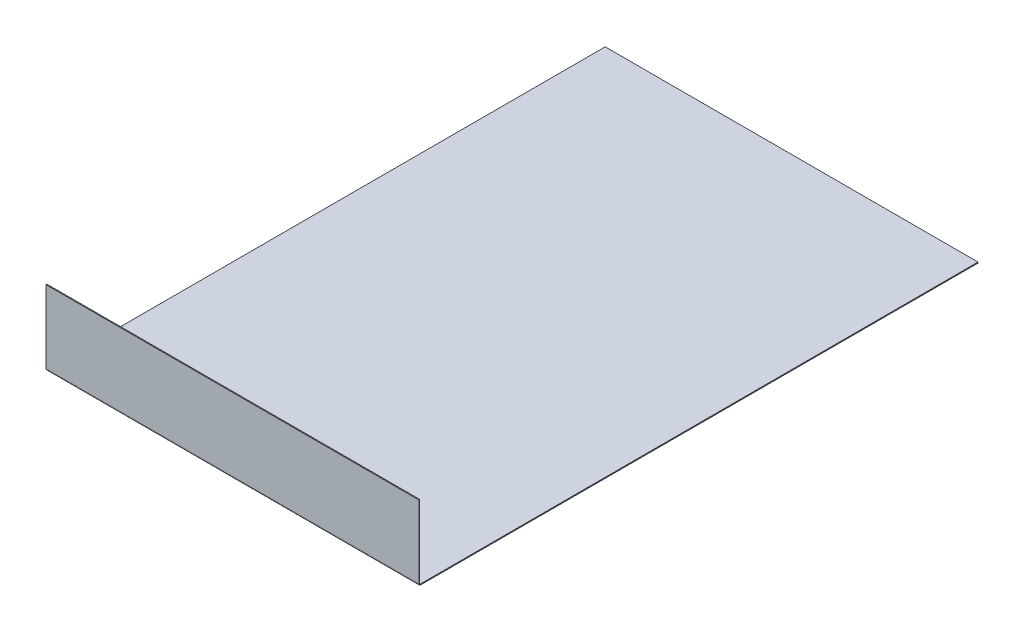
ISO-10303-21;
HEADER;
FILE_DESCRIPTION(('STEP AP214'),'2;1');
FILE_NAME('part.step','',(''),(''),'','','');
FILE_SCHEMA(('AUTOMOTIVE_DESIGN { 1 0 10303 214 1 1 1 1 }'));
ENDSEC;
DATA;
#1=APPLICATION_CONTEXT('core data for automotive mechanical design processes');
#2=APPLICATION_PROTOCOL_DEFINITION('international standard','automotive_design',2000,#1);
#3=PRODUCT_CONTEXT('',#1,'mechanical');
#4=PRODUCT('Part','Part','',(#3));
#5=PRODUCT_RELATED_PRODUCT_CATEGORY('part','',(#4));
#6=PRODUCT_DEFINITION_FORMATION('','',#4);
#7=PRODUCT_DEFINITION_CONTEXT('part definition',#1,'design');
#8=PRODUCT_DEFINITION('design','',#6,#7);
#9=PRODUCT_DEFINITION_SHAPE('','',#8);
#10=(LENGTH_UNIT() NAMED_UNIT(*) SI_UNIT(.MILLI.,.METRE.));
#11=(NAMED_UNIT(*) PLANE_ANGLE_UNIT() SI_UNIT($,.RADIAN.));
#12=(NAMED_UNIT(*) SI_UNIT($,.STERADIAN.) SOLID_ANGLE_UNIT());
#13=UNCERTAINTY_MEASURE_WITH_UNIT(LENGTH_MEASURE(1.E-05),#10,'distance_accuracy_value','');
#14=(GEOMETRIC_REPRESENTATION_CONTEXT(3) GLOBAL_UNCERTAINTY_ASSIGNED_CONTEXT((#13)) GLOBAL_UNIT_ASSIGNED_CONTEXT((#10,
#11,#12)) REPRESENTATION_CONTEXT('',''));
#15=CARTESIAN_POINT('',(0.,0.,0.));
#16=DIRECTION('',(0.,0.,1.));
#17=DIRECTION('',(1.,0.,0.));
#18=AXIS2_PLACEMENT_3D('',#15,#16,#17);
#19=CARTESIAN_POINT('',(-500.,2.5,750.));
#20=DIRECTION('',(0.,1.,0.));
#21=DIRECTION('',(1.,0.,0.));
#22=AXIS2_PLACEMENT_3D('',#19,#20,#21);
#23=PLANE('',#22);
#24=DIRECTION('',(1.,0.,0.));
#25=VECTOR('',#24,1.);
#26=CARTESIAN_POINT('',(-250.,2.5,1495.));
#27=LINE('',#26,#25);
#28=CARTESIAN_POINT('',(-1000.,2.5,1495.));
#29=VERTEX_POINT('',#28);
#30=CARTESIAN_POINT('',(0.,2.5,1495.));
#31=VERTEX_POINT('',#30);
#32=EDGE_CURVE('E162',#29,#31,#27,.T.);
#33=ORIENTED_EDGE('',*,*,#32,.T.);
#34=DIRECTION('',(0.,0.,1.));
#35=VECTOR('',#34,1.);
#36=CARTESIAN_POINT('',(0.,2.5,1500.));
#37=LINE('',#36,#35);
#38=CARTESIAN_POINT('',(0.,2.5,0.));
#39=VERTEX_POINT('',#38);
#40=EDGE_CURVE('E107',#39,#31,#37,.T.);
#41=ORIENTED_EDGE('',*,*,#40,.F.);
#42=DIRECTION('',(1.,0.,0.));
#43=VECTOR('',#42,1.);
#44=CARTESIAN_POINT('',(0.,2.5,0.));
#45=LINE('',#44,#43);
#46=CARTESIAN_POINT('',(-1000.,2.5,0.));
#47=VERTEX_POINT('',#46);
#48=EDGE_CURVE('E11',#47,#39,#45,.T.);
#49=ORIENTED_EDGE('',*,*,#48,.F.);
#50=DIRECTION('',(0.,0.,-1.));
#51=VECTOR('',#50,1.);
#52=CARTESIAN_POINT('',(-1000.,2.5,0.));
#53=LINE('',#52,#51);
#54=EDGE_CURVE('E164',#29,#47,#53,.T.);
#55=ORIENTED_EDGE('',*,*,#54,.F.);
#56=EDGE_LOOP('',(#33,#41,#49,#55));
#57=FACE_BOUND('',#56,.T.);
#58=ADVANCED_FACE('F17',(#57),#23,.T.);
#59=CARTESIAN_POINT('',(-1000.,0.,0.));
#60=DIRECTION('',(0.,0.,-1.));
#61=DIRECTION('',(0.,-1.,0.));
#62=AXIS2_PLACEMENT_3D('',#59,#60,#61);
#63=PLANE('',#62);
#64=ORIENTED_EDGE('',*,*,#48,.T.);
#65=DIRECTION('',(0.,1.,0.));
#66=VECTOR('',#65,1.);
#67=CARTESIAN_POINT('',(0.,0.,0.));
#68=LINE('',#67,#66);
#69=CARTESIAN_POINT('',(0.,0.,0.));
#70=VERTEX_POINT('',#69);
#71=EDGE_CURVE('E187',#70,#39,#68,.T.);
#72=ORIENTED_EDGE('',*,*,#71,.F.);
#73=DIRECTION('',(-1.,0.,0.));
#74=VECTOR('',#73,1.);
#75=CARTESIAN_POINT('',(0.,0.,0.));
#76=LINE('',#75,#74);
#77=CARTESIAN_POINT('',(-1000.,0.,0.));
#78=VERTEX_POINT('',#77);
#79=EDGE_CURVE('E106',#70,#78,#76,.T.);
#80=ORIENTED_EDGE('',*,*,#79,.T.);
#81=DIRECTION('',(0.,1.,0.));
#82=VECTOR('',#81,1.);
#83=CARTESIAN_POINT('',(-1000.,0.,0.));
#84=LINE('',#83,#82);
#85=EDGE_CURVE('E28',#78,#47,#84,.T.);
#86=ORIENTED_EDGE('',*,*,#85,.T.);
#87=EDGE_LOOP('',(#64,#72,#80,#86));
#88=FACE_BOUND('',#87,.T.);
#89=ADVANCED_FACE('F246',(#88),#63,.T.);
#90=CARTESIAN_POINT('',(-1000.,0.,1500.));
#91=DIRECTION('',(-1.,0.,0.));
#92=DIRECTION('',(0.,1.,0.));
#93=AXIS2_PLACEMENT_3D('',#90,#91,#92);
#94=PLANE('',#93);
#95=DIRECTION('',(0.,1.,0.));
#96=VECTOR('',#95,1.);
#97=CARTESIAN_POINT('',(-1000.,1.25,1495.));
#98=LINE('',#97,#96);
#99=CARTESIAN_POINT('',(-1000.,0.,1495.));
#100=VERTEX_POINT('',#99);
#101=EDGE_CURVE('E100',#100,#29,#98,.T.);
#102=ORIENTED_EDGE('',*,*,#101,.T.);
#103=ORIENTED_EDGE('',*,*,#54,.T.);
#104=ORIENTED_EDGE('',*,*,#85,.F.);
#105=DIRECTION('',(0.,0.,1.));
#106=VECTOR('',#105,1.);
#107=CARTESIAN_POINT('',(-1000.,0.,0.));
#108=LINE('',#107,#106);
#109=EDGE_CURVE('E96',#78,#100,#108,.T.);
#110=ORIENTED_EDGE('',*,*,#109,.T.);
#111=EDGE_LOOP('',(#102,#103,#104,#110));
#112=FACE_BOUND('',#111,.T.);
#113=ADVANCED_FACE('F98',(#112),#94,.T.);
#114=CARTESIAN_POINT('',(-500.,0.,750.));
#115=DIRECTION('',(0.,1.,0.));
#116=DIRECTION('',(1.,0.,0.));
#117=AXIS2_PLACEMENT_3D('',#114,#115,#116);
#118=PLANE('',#117);
#119=DIRECTION('',(-1.,0.,0.));
#120=VECTOR('',#119,1.);
#121=CARTESIAN_POINT('',(-250.,0.,1495.));
#122=LINE('',#121,#120);
#123=CARTESIAN_POINT('',(0.,0.,1495.));
#124=VERTEX_POINT('',#123);
#125=EDGE_CURVE('E122',#124,#100,#122,.T.);
#126=ORIENTED_EDGE('',*,*,#125,.T.);
#127=ORIENTED_EDGE('',*,*,#109,.F.);
#128=ORIENTED_EDGE('',*,*,#79,.F.);
#129=DIRECTION('',(0.,0.,-1.));
#130=VECTOR('',#129,1.);
#131=CARTESIAN_POINT('',(0.,0.,1500.));
#132=LINE('',#131,#130);
#133=EDGE_CURVE('E125',#124,#70,#132,.T.);
#134=ORIENTED_EDGE('',*,*,#133,.F.);
#135=EDGE_LOOP('',(#126,#127,#128,#134));
#136=FACE_BOUND('',#135,.T.);
#137=ADVANCED_FACE('F123',(#136),#118,.F.);
#138=CARTESIAN_POINT('',(0.,0.,0.));
#139=DIRECTION('',(1.,0.,0.));
#140=DIRECTION('',(0.,1.,0.));
#141=AXIS2_PLACEMENT_3D('',#138,#139,#140);
#142=PLANE('',#141);
#143=DIRECTION('',(0.,-1.,0.));
#144=VECTOR('',#143,1.);
#145=CARTESIAN_POINT('',(0.,1.25,1495.));
#146=LINE('',#145,#144);
#147=EDGE_CURVE('E119',#31,#124,#146,.T.);
#148=ORIENTED_EDGE('',*,*,#147,.T.);
#149=ORIENTED_EDGE('',*,*,#133,.T.);
#150=ORIENTED_EDGE('',*,*,#71,.T.);
#151=ORIENTED_EDGE('',*,*,#40,.T.);
#152=EDGE_LOOP('',(#148,#149,#150,#151));
#153=FACE_BOUND('',#152,.T.);
#154=ADVANCED_FACE('F255',(#153),#142,.T.);
#155=CARTESIAN_POINT('',(-500.,5.,1495.));
#156=DIRECTION('',(-1.,0.,0.));
#157=DIRECTION('',(0.,-1.,0.));
#158=AXIS2_PLACEMENT_3D('',#155,#156,#157);
#159=CYLINDRICAL_SURFACE('',#158,2.5);
#160=DIRECTION('',(-1.,0.,0.));
#161=VECTOR('',#160,1.);
#162=CARTESIAN_POINT('',(-500.,5.,1497.5));
#163=LINE('',#162,#161);
#164=CARTESIAN_POINT('',(0.,5.,1497.5));
#165=VERTEX_POINT('',#164);
#166=CARTESIAN_POINT('',(-1000.,5.,1497.5));
#167=VERTEX_POINT('',#166);
#168=EDGE_CURVE('E144',#165,#167,#163,.T.);
#169=ORIENTED_EDGE('',*,*,#168,.F.);
#170=CARTESIAN_POINT('',(0.,5.,1495.));
#171=DIRECTION('',(1.,0.,0.));
#172=DIRECTION('',(0.,0.,1.));
#173=AXIS2_PLACEMENT_3D('',#170,#171,#172);
#174=CIRCLE('',#173,2.5);
#175=EDGE_CURVE('E148',#165,#31,#174,.T.);
#176=ORIENTED_EDGE('',*,*,#175,.T.);
#177=ORIENTED_EDGE('',*,*,#32,.F.);
#178=CARTESIAN_POINT('',(-1000.,5.,1495.));
#179=DIRECTION('',(1.,0.,0.));
#180=DIRECTION('',(0.,0.,1.));
#181=AXIS2_PLACEMENT_3D('',#178,#179,#180);
#182=CIRCLE('',#181,2.5);
#183=EDGE_CURVE('E117',#167,#29,#182,.T.);
#184=ORIENTED_EDGE('',*,*,#183,.F.);
#185=EDGE_LOOP('',(#169,#176,#177,#184));
#186=FACE_BOUND('',#185,.T.);
#187=ADVANCED_FACE('F258',(#186),#159,.F.);
#188=CARTESIAN_POINT('',(-500.,99.6725666117695,1500.));
#189=DIRECTION('',(0.,0.,-1.));
#190=DIRECTION('',(-1.,0.,0.));
#191=AXIS2_PLACEMENT_3D('',#188,#189,#190);
#192=PLANE('',#191);
#193=DIRECTION('',(1.,0.,0.));
#194=VECTOR('',#193,1.);
#195=CARTESIAN_POINT('',(-500.,5.,1500.));
#196=LINE('',#195,#194);
#197=CARTESIAN_POINT('',(-1000.,5.,1500.));
#198=VERTEX_POINT('',#197);
#199=CARTESIAN_POINT('',(0.,5.,1500.));
#200=VERTEX_POINT('',#199);
#201=EDGE_CURVE('E134',#198,#200,#196,.T.);
#202=ORIENTED_EDGE('',*,*,#201,.T.);
#203=DIRECTION('',(0.,-1.,0.));
#204=VECTOR('',#203,1.);
#205=CARTESIAN_POINT('',(0.,-6.30973355292326,1500.));
#206=LINE('',#205,#204);
#207=CARTESIAN_POINT('',(0.,200.,1500.));
#208=VERTEX_POINT('',#207);
#209=EDGE_CURVE('E156',#208,#200,#206,.T.);
#210=ORIENTED_EDGE('',*,*,#209,.F.);
#211=DIRECTION('',(1.,0.,0.));
#212=VECTOR('',#211,1.);
#213=CARTESIAN_POINT('',(-1000.,200.,1500.));
#214=LINE('',#213,#212);
#215=CARTESIAN_POINT('',(-1000.,200.,1500.));
#216=VERTEX_POINT('',#215);
#217=EDGE_CURVE('E159',#216,#208,#214,.T.);
#218=ORIENTED_EDGE('',*,*,#217,.F.);
#219=DIRECTION('',(0.,1.,0.));
#220=VECTOR('',#219,1.);
#221=CARTESIAN_POINT('',(-1000.,5.,1500.));
#222=LINE('',#221,#220);
#223=EDGE_CURVE('E191',#198,#216,#222,.T.);
#224=ORIENTED_EDGE('',*,*,#223,.F.);
#225=EDGE_LOOP('',(#202,#210,#218,#224));
#226=FACE_BOUND('',#225,.T.);
#227=ADVANCED_FACE('F256',(#226),#192,.F.);
#228=CARTESIAN_POINT('',(-1000.,200.,1497.5));
#229=DIRECTION('',(0.,1.,0.));
#230=DIRECTION('',(0.,0.,-1.));
#231=AXIS2_PLACEMENT_3D('',#228,#229,#230);
#232=PLANE('',#231);
#233=ORIENTED_EDGE('',*,*,#217,.T.);
#234=DIRECTION('',(0.,0.,1.));
#235=VECTOR('',#234,1.);
#236=CARTESIAN_POINT('',(0.,200.,1497.5));
#237=LINE('',#236,#235);
#238=CARTESIAN_POINT('',(0.,200.,1497.5));
#239=VERTEX_POINT('',#238);
#240=EDGE_CURVE('E153',#239,#208,#237,.T.);
#241=ORIENTED_EDGE('',*,*,#240,.F.);
#242=DIRECTION('',(1.,0.,0.));
#243=VECTOR('',#242,1.);
#244=CARTESIAN_POINT('',(-1000.,200.,1497.5));
#245=LINE('',#244,#243);
#246=CARTESIAN_POINT('',(-1000.,200.,1497.5));
#247=VERTEX_POINT('',#246);
#248=EDGE_CURVE('E149',#247,#239,#245,.T.);
#249=ORIENTED_EDGE('',*,*,#248,.F.);
#250=DIRECTION('',(0.,0.,1.));
#251=VECTOR('',#250,1.);
#252=CARTESIAN_POINT('',(-1000.,200.,1497.5));
#253=LINE('',#252,#251);
#254=EDGE_CURVE('E163',#247,#216,#253,.T.);
#255=ORIENTED_EDGE('',*,*,#254,.T.);
#256=EDGE_LOOP('',(#233,#241,#249,#255));
#257=FACE_BOUND('',#256,.T.);
#258=ADVANCED_FACE('F233',(#257),#232,.T.);
#259=CARTESIAN_POINT('',(-1000.,5.,1497.5));
#260=DIRECTION('',(-1.,0.,0.));
#261=DIRECTION('',(0.,0.,1.));
#262=AXIS2_PLACEMENT_3D('',#259,#260,#261);
#263=PLANE('',#262);
#264=DIRECTION('',(0.,0.,1.));
#265=VECTOR('',#264,1.);
#266=CARTESIAN_POINT('',(-1000.,5.,1498.05));
#267=LINE('',#266,#265);
#268=EDGE_CURVE('E152',#167,#198,#267,.T.);
#269=ORIENTED_EDGE('',*,*,#268,.T.);
#270=ORIENTED_EDGE('',*,*,#223,.T.);
#271=ORIENTED_EDGE('',*,*,#254,.F.);
#272=DIRECTION('',(0.,-1.,0.));
#273=VECTOR('',#272,1.);
#274=CARTESIAN_POINT('',(-1000.,-6.30973355292326,1497.5));
#275=LINE('',#274,#273);
#276=EDGE_CURVE('E21',#247,#167,#275,.T.);
#277=ORIENTED_EDGE('',*,*,#276,.T.);
#278=EDGE_LOOP('',(#269,#270,#271,#277));
#279=FACE_BOUND('',#278,.T.);
#280=ADVANCED_FACE('F228',(#279),#263,.T.);
#281=CARTESIAN_POINT('',(0.,5.,1500.));
#282=DIRECTION('',(1.,0.,0.));
#283=DIRECTION('',(0.,1.,0.));
#284=AXIS2_PLACEMENT_3D('',#281,#282,#283);
#285=PLANE('',#284);
#286=DIRECTION('',(0.,0.,-1.));
#287=VECTOR('',#286,1.);
#288=CARTESIAN_POINT('',(0.,5.,1498.05));
#289=LINE('',#288,#287);
#290=EDGE_CURVE('E169',#200,#165,#289,.T.);
#291=ORIENTED_EDGE('',*,*,#290,.F.);
#292=CARTESIAN_POINT('',(0.,5.,1495.));
#293=DIRECTION('',(1.,0.,0.));
#294=DIRECTION('',(0.,0.,1.));
#295=AXIS2_PLACEMENT_3D('',#292,#293,#294);
#296=CIRCLE('',#295,5.);
#297=EDGE_CURVE('E130',#200,#124,#296,.T.);
#298=ORIENTED_EDGE('',*,*,#297,.T.);
#299=ORIENTED_EDGE('',*,*,#147,.F.);
#300=ORIENTED_EDGE('',*,*,#175,.F.);
#301=EDGE_LOOP('',(#291,#298,#299,#300));
#302=FACE_BOUND('',#301,.T.);
#303=ADVANCED_FACE('F19',(#302),#285,.T.);
#304=CARTESIAN_POINT('',(-1000.,5.,1497.5));
#305=DIRECTION('',(-1.,0.,0.));
#306=DIRECTION('',(0.,0.,1.));
#307=AXIS2_PLACEMENT_3D('',#304,#305,#306);
#308=PLANE('',#307);
#309=ORIENTED_EDGE('',*,*,#268,.F.);
#310=ORIENTED_EDGE('',*,*,#183,.T.);
#311=ORIENTED_EDGE('',*,*,#101,.F.);
#312=CARTESIAN_POINT('',(-1000.,5.,1495.));
#313=DIRECTION('',(-1.,0.,0.));
#314=DIRECTION('',(0.,-1.,0.));
#315=AXIS2_PLACEMENT_3D('',#312,#313,#314);
#316=CIRCLE('',#315,5.);
#317=EDGE_CURVE('E114',#100,#198,#316,.T.);
#318=ORIENTED_EDGE('',*,*,#317,.T.);
#319=EDGE_LOOP('',(#309,#310,#311,#318));
#320=FACE_BOUND('',#319,.T.);
#321=ADVANCED_FACE('F112',(#320),#308,.T.);
#322=CARTESIAN_POINT('',(-500.,99.6725666117695,1497.5));
#323=DIRECTION('',(0.,0.,-1.));
#324=DIRECTION('',(-1.,0.,0.));
#325=AXIS2_PLACEMENT_3D('',#322,#323,#324);
#326=PLANE('',#325);
#327=ORIENTED_EDGE('',*,*,#168,.T.);
#328=ORIENTED_EDGE('',*,*,#276,.F.);
#329=ORIENTED_EDGE('',*,*,#248,.T.);
#330=DIRECTION('',(0.,-1.,0.));
#331=VECTOR('',#330,1.);
#332=CARTESIAN_POINT('',(0.,-6.30973355292326,1497.5));
#333=LINE('',#332,#331);
#334=EDGE_CURVE('E157',#239,#165,#333,.T.);
#335=ORIENTED_EDGE('',*,*,#334,.T.);
#336=EDGE_LOOP('',(#327,#328,#329,#335));
#337=FACE_BOUND('',#336,.T.);
#338=ADVANCED_FACE('F230',(#337),#326,.T.);
#339=CARTESIAN_POINT('',(0.,5.,1497.5));
#340=DIRECTION('',(1.,0.,0.));
#341=DIRECTION('',(0.,1.,0.));
#342=AXIS2_PLACEMENT_3D('',#339,#340,#341);
#343=PLANE('',#342);
#344=ORIENTED_EDGE('',*,*,#290,.T.);
#345=ORIENTED_EDGE('',*,*,#334,.F.);
#346=ORIENTED_EDGE('',*,*,#240,.T.);
#347=ORIENTED_EDGE('',*,*,#209,.T.);
#348=EDGE_LOOP('',(#344,#345,#346,#347));
#349=FACE_BOUND('',#348,.T.);
#350=ADVANCED_FACE('F234',(#349),#343,.T.);
#351=CARTESIAN_POINT('',(-500.,5.,1495.));
#352=DIRECTION('',(-1.,0.,0.));
#353=DIRECTION('',(0.,-1.,0.));
#354=AXIS2_PLACEMENT_3D('',#351,#352,#353);
#355=CYLINDRICAL_SURFACE('',#354,5.);
#356=ORIENTED_EDGE('',*,*,#201,.F.);
#357=ORIENTED_EDGE('',*,*,#317,.F.);
#358=ORIENTED_EDGE('',*,*,#125,.F.);
#359=ORIENTED_EDGE('',*,*,#297,.F.);
#360=EDGE_LOOP('',(#356,#357,#358,#359));
#361=FACE_BOUND('',#360,.T.);
#362=ADVANCED_FACE('F132',(#361),#355,.T.);
#363=CLOSED_SHELL('',(#58,#89,#113,#137,#154,#187,#227,#258,#280,#303,#321,#338,#350,#362));
#364=MANIFOLD_SOLID_BREP('B1',#363);
#365=ADVANCED_BREP_SHAPE_REPRESENTATION('',(#18,#364),#14);
#366=SHAPE_DEFINITION_REPRESENTATION(#9,#365);
ENDSEC;
END-ISO-10303-21;
